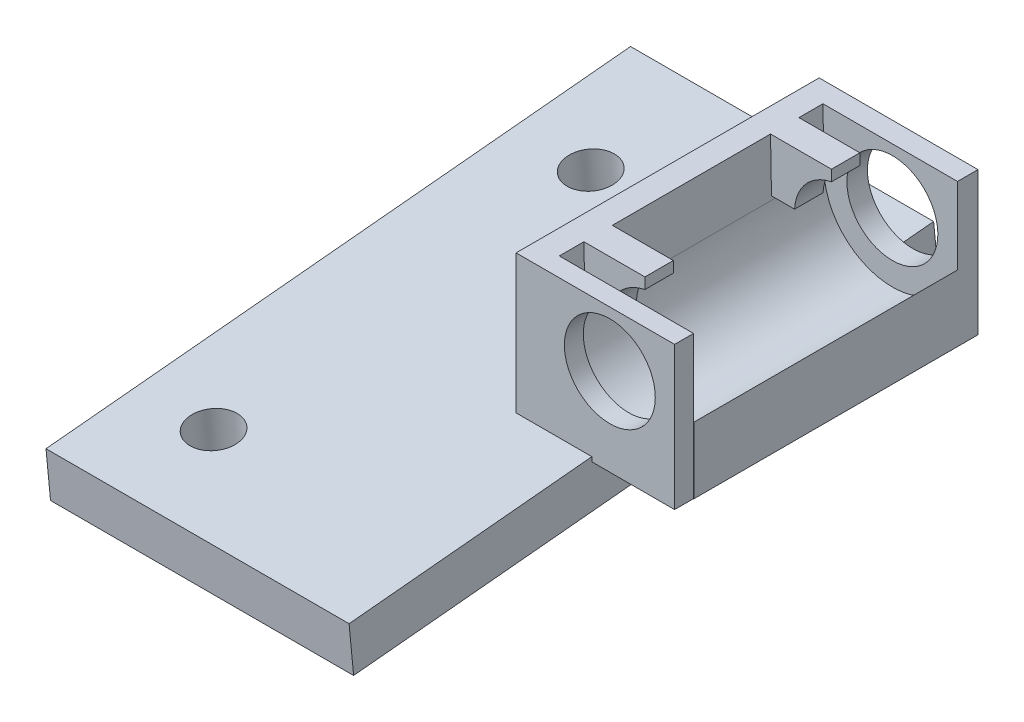
ISO-10303-21;
HEADER;
FILE_DESCRIPTION(('STEP AP214'),'2;1');
FILE_NAME('part.step','',(''),(''),'','','');
FILE_SCHEMA(('AUTOMOTIVE_DESIGN { 1 0 10303 214 1 1 1 1 }'));
ENDSEC;
DATA;
#1=APPLICATION_CONTEXT('core data for automotive mechanical design processes');
#2=APPLICATION_PROTOCOL_DEFINITION('international standard','automotive_design',2000,#1);
#3=PRODUCT_CONTEXT('',#1,'mechanical');
#4=PRODUCT('Part','Part','',(#3));
#5=PRODUCT_RELATED_PRODUCT_CATEGORY('part','',(#4));
#6=PRODUCT_DEFINITION_FORMATION('','',#4);
#7=PRODUCT_DEFINITION_CONTEXT('part definition',#1,'design');
#8=PRODUCT_DEFINITION('design','',#6,#7);
#9=PRODUCT_DEFINITION_SHAPE('','',#8);
#10=(LENGTH_UNIT() NAMED_UNIT(*) SI_UNIT(.MILLI.,.METRE.));
#11=(NAMED_UNIT(*) PLANE_ANGLE_UNIT() SI_UNIT($,.RADIAN.));
#12=(NAMED_UNIT(*) SI_UNIT($,.STERADIAN.) SOLID_ANGLE_UNIT());
#13=UNCERTAINTY_MEASURE_WITH_UNIT(LENGTH_MEASURE(1.E-05),#10,'distance_accuracy_value','');
#14=(GEOMETRIC_REPRESENTATION_CONTEXT(3) GLOBAL_UNCERTAINTY_ASSIGNED_CONTEXT((#13)) GLOBAL_UNIT_ASSIGNED_CONTEXT((#10,
#11,#12)) REPRESENTATION_CONTEXT('',''));
#15=CARTESIAN_POINT('',(0.,0.,0.));
#16=DIRECTION('',(0.,0.,1.));
#17=DIRECTION('',(1.,0.,0.));
#18=AXIS2_PLACEMENT_3D('',#15,#16,#17);
#19=CARTESIAN_POINT('',(0.,-0.379856494550895,-38.1000000000001));
#20=DIRECTION('',(0.,-1.,0.));
#21=DIRECTION('',(0.,0.,-1.));
#22=AXIS2_PLACEMENT_3D('',#19,#20,#21);
#23=PLANE('',#22);
#24=DIRECTION('',(1.,0.,0.));
#25=VECTOR('',#24,1.);
#26=CARTESIAN_POINT('',(-215.570198928087,-0.379856494550895,2.54));
#27=LINE('',#26,#25);
#28=CARTESIAN_POINT('',(-205.410198928087,-0.379856494550895,2.54));
#29=VERTEX_POINT('',#28);
#30=CARTESIAN_POINT('',(-194.315789963556,-0.379856494550895,2.54));
#31=VERTEX_POINT('',#30);
#32=EDGE_CURVE('E411',#29,#31,#27,.T.);
#33=ORIENTED_EDGE('',*,*,#32,.F.);
#34=DIRECTION('',(0.,0.,-1.));
#35=VECTOR('',#34,1.);
#36=CARTESIAN_POINT('',(-205.410198928087,-0.379856494550895,-38.1));
#37=LINE('',#36,#35);
#38=CARTESIAN_POINT('',(-205.410198928087,-0.379856494550895,-38.1000000000001));
#39=VERTEX_POINT('',#38);
#40=EDGE_CURVE('E291',#29,#39,#37,.T.);
#41=ORIENTED_EDGE('',*,*,#40,.T.);
#42=DIRECTION('',(1.,0.,0.));
#43=VECTOR('',#42,1.);
#44=CARTESIAN_POINT('',(0.,-0.379856494550895,-38.1000000000001));
#45=LINE('',#44,#43);
#46=CARTESIAN_POINT('',(-194.271100300856,-0.379856494550895,-38.1000000000001));
#47=VERTEX_POINT('',#46);
#48=EDGE_CURVE('E446',#39,#47,#45,.T.);
#49=ORIENTED_EDGE('',*,*,#48,.T.);
#50=DIRECTION('',(0.,0.,1.));
#51=VECTOR('',#50,1.);
#52=CARTESIAN_POINT('',(-194.271100300856,-0.379856494550895,-38.1000000000001));
#53=LINE('',#52,#51);
#54=CARTESIAN_POINT('',(-194.271100300856,-0.379856494550895,0.));
#55=VERTEX_POINT('',#54);
#56=EDGE_CURVE('E471',#47,#55,#53,.T.);
#57=ORIENTED_EDGE('',*,*,#56,.T.);
#58=DIRECTION('',(1.,0.,0.));
#59=VECTOR('',#58,1.);
#60=CARTESIAN_POINT('',(0.,-0.379856494550895,0.));
#61=LINE('',#60,#59);
#62=CARTESIAN_POINT('',(-194.315789963556,-0.379856494550895,0.));
#63=VERTEX_POINT('',#62);
#64=EDGE_CURVE('E460',#63,#55,#61,.T.);
#65=ORIENTED_EDGE('',*,*,#64,.F.);
#66=DIRECTION('',(0.,0.,-1.));
#67=VECTOR('',#66,1.);
#68=CARTESIAN_POINT('',(-194.315789963556,-0.379856494550895,2.54));
#69=LINE('',#68,#67);
#70=EDGE_CURVE('E433',#31,#63,#69,.T.);
#71=ORIENTED_EDGE('',*,*,#70,.F.);
#72=EDGE_LOOP('',(#33,#41,#49,#57,#65,#71));
#73=FACE_BOUND('',#72,.T.);
#74=ADVANCED_FACE('F47',(#73),#23,.T.);
#75=CARTESIAN_POINT('',(-203.,11.3497927017428,-38.1000000000001));
#76=DIRECTION('',(0.,0.,1.));
#77=DIRECTION('',(1.,0.,0.));
#78=AXIS2_PLACEMENT_3D('',#75,#76,#77);
#79=CYLINDRICAL_SURFACE('',#78,9.17500000000006);
#80=CARTESIAN_POINT('',(-203.,11.3497927017428,-35.3500000000005));
#81=DIRECTION('',(0.,0.,1.));
#82=DIRECTION('',(0.,-1.,0.));
#83=AXIS2_PLACEMENT_3D('',#80,#81,#82);
#84=CIRCLE('',#83,9.17500000000006);
#85=CARTESIAN_POINT('',(-194.271100300856,8.52367610077182,-35.3500000000005));
#86=VERTEX_POINT('',#85);
#87=CARTESIAN_POINT('',(-212.173440462279,11.1806327625625,-35.3500000000005));
#88=VERTEX_POINT('',#87);
#89=EDGE_CURVE('E386',#86,#88,#84,.F.);
#90=ORIENTED_EDGE('',*,*,#89,.T.);
#91=DIRECTION('',(0.,0.,1.));
#92=VECTOR('',#91,1.);
#93=CARTESIAN_POINT('',(-212.173440462279,11.1806327625625,-38.1000000000001));
#94=LINE('',#93,#92);
#95=CARTESIAN_POINT('',(-212.173440462279,11.1806327625625,0.));
#96=VERTEX_POINT('',#95);
#97=EDGE_CURVE('E452',#88,#96,#94,.T.);
#98=ORIENTED_EDGE('',*,*,#97,.T.);
#99=CARTESIAN_POINT('',(-203.,11.3497927017428,0.));
#100=DIRECTION('',(0.,0.,1.));
#101=DIRECTION('',(1.,0.,0.));
#102=AXIS2_PLACEMENT_3D('',#99,#100,#101);
#103=CIRCLE('',#102,9.17500000000006);
#104=CARTESIAN_POINT('',(-194.315789963556,8.38919799072162,0.));
#105=VERTEX_POINT('',#104);
#106=EDGE_CURVE('E453',#96,#105,#103,.T.);
#107=ORIENTED_EDGE('',*,*,#106,.T.);
#108=CARTESIAN_POINT('',(-194.271100300856,8.52367610077182,0.));
#109=VERTEX_POINT('',#108);
#110=EDGE_CURVE('E437',#105,#109,#103,.T.);
#111=ORIENTED_EDGE('',*,*,#110,.T.);
#112=DIRECTION('',(0.,0.,1.));
#113=VECTOR('',#112,1.);
#114=CARTESIAN_POINT('',(-194.271100300856,8.52367610077182,-38.1000000000001));
#115=LINE('',#114,#113);
#116=EDGE_CURVE('E467',#86,#109,#115,.T.);
#117=ORIENTED_EDGE('',*,*,#116,.F.);
#118=EDGE_LOOP('',(#90,#98,#107,#111,#117));
#119=FACE_BOUND('',#118,.T.);
#120=ADVANCED_FACE('F49',(#119),#79,.F.);
#121=CARTESIAN_POINT('',(-194.271100300856,0.,-38.1000000000001));
#122=DIRECTION('',(1.,0.,0.));
#123=DIRECTION('',(0.,0.,-1.));
#124=AXIS2_PLACEMENT_3D('',#121,#122,#123);
#125=PLANE('',#124);
#126=DIRECTION('',(0.,1.,0.));
#127=VECTOR('',#126,1.);
#128=CARTESIAN_POINT('',(-194.271100300856,0.,0.));
#129=LINE('',#128,#127);
#130=EDGE_CURVE('E443',#55,#109,#129,.T.);
#131=ORIENTED_EDGE('',*,*,#130,.F.);
#132=ORIENTED_EDGE('',*,*,#56,.F.);
#133=DIRECTION('',(0.,1.,0.));
#134=VECTOR('',#133,1.);
#135=CARTESIAN_POINT('',(-194.271100300856,0.,-38.1000000000001));
#136=LINE('',#135,#134);
#137=CARTESIAN_POINT('',(-194.271100300856,18.8069348308094,-38.1000000000001));
#138=VERTEX_POINT('',#137);
#139=EDGE_CURVE('E449',#47,#138,#136,.T.);
#140=ORIENTED_EDGE('',*,*,#139,.T.);
#141=DIRECTION('',(0.,0.,-1.));
#142=VECTOR('',#141,1.);
#143=CARTESIAN_POINT('',(-194.271100300856,18.8069348308094,-6.68321497454979));
#144=LINE('',#143,#142);
#145=CARTESIAN_POINT('',(-194.271100300856,18.8069348308094,-35.3500000000005));
#146=VERTEX_POINT('',#145);
#147=EDGE_CURVE('E382',#146,#138,#144,.T.);
#148=ORIENTED_EDGE('',*,*,#147,.F.);
#149=DIRECTION('',(0.,-1.,0.));
#150=VECTOR('',#149,1.);
#151=CARTESIAN_POINT('',(-194.271100300856,-0.379856494550899,-35.3500000000005));
#152=LINE('',#151,#150);
#153=EDGE_CURVE('E366',#146,#86,#152,.T.);
#154=ORIENTED_EDGE('',*,*,#153,.T.);
#155=ORIENTED_EDGE('',*,*,#116,.T.);
#156=EDGE_LOOP('',(#131,#132,#140,#148,#154,#155));
#157=FACE_BOUND('',#156,.T.);
#158=ADVANCED_FACE('F555',(#157),#125,.T.);
#159=CARTESIAN_POINT('',(-215.570198928087,0.,-38.1000000000001));
#160=DIRECTION('',(-1.,0.,0.));
#161=DIRECTION('',(0.,0.,1.));
#162=AXIS2_PLACEMENT_3D('',#159,#160,#161);
#163=PLANE('',#162);
#164=DIRECTION('',(0.,0.0954577562183424,-0.995433481844849));
#165=VECTOR('',#164,1.);
#166=CARTESIAN_POINT('',(-215.570198928087,4.08284979506725,-37.7084724017005));
#167=LINE('',#166,#165);
#168=CARTESIAN_POINT('',(-215.570198928087,0.223195748106981,2.54));
#169=VERTEX_POINT('',#168);
#170=CARTESIAN_POINT('',(-215.570198928087,4.12039559467402,-38.1000000000001));
#171=VERTEX_POINT('',#170);
#172=EDGE_CURVE('E299',#169,#171,#167,.T.);
#173=ORIENTED_EDGE('',*,*,#172,.F.);
#174=DIRECTION('',(0.,-1.,0.));
#175=VECTOR('',#174,1.);
#176=CARTESIAN_POINT('',(-215.570198928087,-0.379856494550895,2.54));
#177=LINE('',#176,#175);
#178=CARTESIAN_POINT('',(-215.570198928087,18.8069348308094,2.54));
#179=VERTEX_POINT('',#178);
#180=EDGE_CURVE('E407',#179,#169,#177,.T.);
#181=ORIENTED_EDGE('',*,*,#180,.F.);
#182=DIRECTION('',(0.,0.,1.));
#183=VECTOR('',#182,1.);
#184=CARTESIAN_POINT('',(-215.570198928087,18.8069348308094,-38.1000000000001));
#185=LINE('',#184,#183);
#186=CARTESIAN_POINT('',(-215.570198928087,18.8069348308094,-38.1000000000001));
#187=VERTEX_POINT('',#186);
#188=EDGE_CURVE('E474',#187,#179,#185,.T.);
#189=ORIENTED_EDGE('',*,*,#188,.F.);
#190=DIRECTION('',(0.,-1.,0.));
#191=VECTOR('',#190,1.);
#192=CARTESIAN_POINT('',(-215.570198928087,0.,-38.1000000000001));
#193=LINE('',#192,#191);
#194=EDGE_CURVE('E442',#187,#171,#193,.T.);
#195=ORIENTED_EDGE('',*,*,#194,.T.);
#196=EDGE_LOOP('',(#173,#181,#189,#195));
#197=FACE_BOUND('',#196,.T.);
#198=ADVANCED_FACE('F561',(#197),#163,.T.);
#199=CARTESIAN_POINT('',(0.,18.8069348308094,-38.1000000000001));
#200=DIRECTION('',(0.,1.,0.));
#201=DIRECTION('',(0.,0.,1.));
#202=AXIS2_PLACEMENT_3D('',#199,#200,#201);
#203=PLANE('',#202);
#204=DIRECTION('',(0.,0.,1.));
#205=VECTOR('',#204,1.);
#206=CARTESIAN_POINT('',(-212.314070883252,18.8069348308094,-38.1000000000001));
#207=LINE('',#206,#205);
#208=CARTESIAN_POINT('',(-212.314070883252,18.8069348308094,-28.3210000000001));
#209=VERTEX_POINT('',#208);
#210=CARTESIAN_POINT('',(-212.314070883252,18.8069348308094,-7.112));
#211=VERTEX_POINT('',#210);
#212=EDGE_CURVE('E480',#209,#211,#207,.T.);
#213=ORIENTED_EDGE('',*,*,#212,.F.);
#214=DIRECTION('',(-1.,0.,0.));
#215=VECTOR('',#214,1.);
#216=CARTESIAN_POINT('',(-204.140198928087,18.8069348308094,-28.3210000000001));
#217=LINE('',#216,#215);
#218=CARTESIAN_POINT('',(-204.140198928087,18.8069348308094,-28.3210000000001));
#219=VERTEX_POINT('',#218);
#220=EDGE_CURVE('E331',#219,#209,#217,.T.);
#221=ORIENTED_EDGE('',*,*,#220,.F.);
#222=DIRECTION('',(0.,0.,-1.));
#223=VECTOR('',#222,1.);
#224=CARTESIAN_POINT('',(-204.140198928087,18.8069348308094,-28.3210000000001));
#225=LINE('',#224,#223);
#226=CARTESIAN_POINT('',(-204.140198928087,18.8069348308094,-32.131));
#227=VERTEX_POINT('',#226);
#228=EDGE_CURVE('E344',#219,#227,#225,.T.);
#229=ORIENTED_EDGE('',*,*,#228,.T.);
#230=DIRECTION('',(-1.,0.,0.));
#231=VECTOR('',#230,1.);
#232=CARTESIAN_POINT('',(-204.140198928087,18.8069348308094,-32.131));
#233=LINE('',#232,#231);
#234=CARTESIAN_POINT('',(-212.314070883252,18.8069348308094,-32.131));
#235=VERTEX_POINT('',#234);
#236=EDGE_CURVE('E335',#227,#235,#233,.T.);
#237=ORIENTED_EDGE('',*,*,#236,.T.);
#238=CARTESIAN_POINT('',(-212.314070883252,18.8069348308094,-35.3500000000005));
#239=VERTEX_POINT('',#238);
#240=EDGE_CURVE('E477',#239,#235,#207,.T.);
#241=ORIENTED_EDGE('',*,*,#240,.F.);
#242=DIRECTION('',(1.,0.,0.));
#243=VECTOR('',#242,1.);
#244=CARTESIAN_POINT('',(-194.271100300856,18.8069348308094,-35.3500000000005));
#245=LINE('',#244,#243);
#246=EDGE_CURVE('E390',#239,#146,#245,.T.);
#247=ORIENTED_EDGE('',*,*,#246,.T.);
#248=ORIENTED_EDGE('',*,*,#147,.T.);
#249=DIRECTION('',(-1.,0.,0.));
#250=VECTOR('',#249,1.);
#251=CARTESIAN_POINT('',(0.,18.8069348308094,-38.1000000000001));
#252=LINE('',#251,#250);
#253=EDGE_CURVE('E438',#138,#187,#252,.T.);
#254=ORIENTED_EDGE('',*,*,#253,.T.);
#255=ORIENTED_EDGE('',*,*,#188,.T.);
#256=DIRECTION('',(-1.,0.,0.));
#257=VECTOR('',#256,1.);
#258=CARTESIAN_POINT('',(-215.570198928087,18.8069348308094,2.54));
#259=LINE('',#258,#257);
#260=CARTESIAN_POINT('',(-194.315789963556,18.8069348308094,2.54));
#261=VERTEX_POINT('',#260);
#262=EDGE_CURVE('E418',#261,#179,#259,.T.);
#263=ORIENTED_EDGE('',*,*,#262,.F.);
#264=DIRECTION('',(0.,0.,-1.));
#265=VECTOR('',#264,1.);
#266=CARTESIAN_POINT('',(-194.315789963556,18.8069348308094,2.54));
#267=LINE('',#266,#265);
#268=CARTESIAN_POINT('',(-194.315789963556,18.8069348308094,0.));
#269=VERTEX_POINT('',#268);
#270=EDGE_CURVE('E422',#261,#269,#267,.T.);
#271=ORIENTED_EDGE('',*,*,#270,.T.);
#272=DIRECTION('',(-1.,0.,0.));
#273=VECTOR('',#272,1.);
#274=CARTESIAN_POINT('',(-215.570198928087,18.8069348308094,0.));
#275=LINE('',#274,#273);
#276=CARTESIAN_POINT('',(-212.314070883252,18.8069348308094,0.));
#277=VERTEX_POINT('',#276);
#278=EDGE_CURVE('E412',#269,#277,#275,.T.);
#279=ORIENTED_EDGE('',*,*,#278,.T.);
#280=CARTESIAN_POINT('',(-212.314070883252,18.8069348308094,-3.302));
#281=VERTEX_POINT('',#280);
#282=EDGE_CURVE('E481',#281,#277,#207,.T.);
#283=ORIENTED_EDGE('',*,*,#282,.F.);
#284=DIRECTION('',(-1.,0.,0.));
#285=VECTOR('',#284,1.);
#286=CARTESIAN_POINT('',(-204.140198928087,18.8069348308094,-3.302));
#287=LINE('',#286,#285);
#288=CARTESIAN_POINT('',(-204.140198928087,18.8069348308094,-3.302));
#289=VERTEX_POINT('',#288);
#290=EDGE_CURVE('E362',#289,#281,#287,.T.);
#291=ORIENTED_EDGE('',*,*,#290,.F.);
#292=DIRECTION('',(0.,0.,-1.));
#293=VECTOR('',#292,1.);
#294=CARTESIAN_POINT('',(-204.140198928087,18.8069348308094,-7.112));
#295=LINE('',#294,#293);
#296=CARTESIAN_POINT('',(-204.140198928087,18.8069348308094,-7.112));
#297=VERTEX_POINT('',#296);
#298=EDGE_CURVE('E354',#289,#297,#295,.T.);
#299=ORIENTED_EDGE('',*,*,#298,.T.);
#300=DIRECTION('',(-1.,0.,0.));
#301=VECTOR('',#300,1.);
#302=CARTESIAN_POINT('',(-204.140198928087,18.8069348308094,-7.112));
#303=LINE('',#302,#301);
#304=EDGE_CURVE('E370',#297,#211,#303,.T.);
#305=ORIENTED_EDGE('',*,*,#304,.T.);
#306=EDGE_LOOP('',(#213,#221,#229,#237,#241,#247,#248,#254,#255,#263,#271,#279,#283,#291,#299,#305));
#307=FACE_BOUND('',#306,.T.);
#308=ADVANCED_FACE('F518',(#307),#203,.T.);
#309=CARTESIAN_POINT('',(-211.895214587435,-3.90738695672297,-38.1000000000001));
#310=DIRECTION('',(0.999830023136685,0.0184370505910235,0.));
#311=DIRECTION('',(-0.0184370505910235,0.999830023136685,0.));
#312=AXIS2_PLACEMENT_3D('',#309,#310,#311);
#313=PLANE('',#312);
#314=DIRECTION('',(-0.0184370505910235,0.999830023136685,0.));
#315=VECTOR('',#314,1.);
#316=CARTESIAN_POINT('',(-211.895214587435,-3.90738695672298,-32.1310000000001));
#317=LINE('',#316,#315);
#318=CARTESIAN_POINT('',(-212.182924287561,11.6949348308094,-32.1310000000001));
#319=VERTEX_POINT('',#318);
#320=EDGE_CURVE('E56',#319,#235,#317,.T.);
#321=ORIENTED_EDGE('',*,*,#320,.F.);
#322=DIRECTION('',(0.,0.,-1.));
#323=VECTOR('',#322,1.);
#324=CARTESIAN_POINT('',(-212.182924287561,11.6949348308094,-38.1000000000001));
#325=LINE('',#324,#323);
#326=CARTESIAN_POINT('',(-212.182924287561,11.6949348308094,-28.3210000000001));
#327=VERTEX_POINT('',#326);
#328=EDGE_CURVE('E503',#327,#319,#325,.T.);
#329=ORIENTED_EDGE('',*,*,#328,.F.);
#330=DIRECTION('',(0.0184370505910235,-0.999830023136685,0.));
#331=VECTOR('',#330,1.);
#332=CARTESIAN_POINT('',(-211.895214587435,-3.90738695672297,-28.3210000000001));
#333=LINE('',#332,#331);
#334=EDGE_CURVE('E499',#209,#327,#333,.T.);
#335=ORIENTED_EDGE('',*,*,#334,.F.);
#336=ORIENTED_EDGE('',*,*,#212,.T.);
#337=DIRECTION('',(-0.0184370505910235,0.999830023136685,0.));
#338=VECTOR('',#337,1.);
#339=CARTESIAN_POINT('',(-211.895214587435,-3.90738695672297,-7.112));
#340=LINE('',#339,#338);
#341=CARTESIAN_POINT('',(-212.182924287561,11.6949348308094,-7.112));
#342=VERTEX_POINT('',#341);
#343=EDGE_CURVE('E487',#342,#211,#340,.T.);
#344=ORIENTED_EDGE('',*,*,#343,.F.);
#345=DIRECTION('',(0.,0.,-1.));
#346=VECTOR('',#345,1.);
#347=CARTESIAN_POINT('',(-212.182924287561,11.6949348308094,-38.1000000000001));
#348=LINE('',#347,#346);
#349=CARTESIAN_POINT('',(-212.182924287561,11.6949348308094,-3.302));
#350=VERTEX_POINT('',#349);
#351=EDGE_CURVE('E491',#350,#342,#348,.T.);
#352=ORIENTED_EDGE('',*,*,#351,.F.);
#353=DIRECTION('',(0.0184370505910235,-0.999830023136685,0.));
#354=VECTOR('',#353,1.);
#355=CARTESIAN_POINT('',(-211.895214587435,-3.90738695672297,-3.302));
#356=LINE('',#355,#354);
#357=EDGE_CURVE('E495',#281,#350,#356,.T.);
#358=ORIENTED_EDGE('',*,*,#357,.F.);
#359=ORIENTED_EDGE('',*,*,#282,.T.);
#360=DIRECTION('',(-0.0184370505910235,0.999830023136685,0.));
#361=VECTOR('',#360,1.);
#362=CARTESIAN_POINT('',(-211.895214587435,-3.90738695672297,0.));
#363=LINE('',#362,#361);
#364=EDGE_CURVE('E456',#96,#277,#363,.T.);
#365=ORIENTED_EDGE('',*,*,#364,.F.);
#366=ORIENTED_EDGE('',*,*,#97,.F.);
#367=DIRECTION('',(0.0184370505910235,-0.999830023136685,0.));
#368=VECTOR('',#367,1.);
#369=CARTESIAN_POINT('',(-211.895214587435,-3.90738695672297,-35.3500000000005));
#370=LINE('',#369,#368);
#371=EDGE_CURVE('E470',#239,#88,#370,.T.);
#372=ORIENTED_EDGE('',*,*,#371,.F.);
#373=ORIENTED_EDGE('',*,*,#240,.T.);
#374=EDGE_LOOP('',(#321,#329,#335,#336,#344,#352,#358,#359,#365,#366,#372,#373));
#375=FACE_BOUND('',#374,.T.);
#376=ADVANCED_FACE('F531',(#375),#313,.T.);
#377=CARTESIAN_POINT('',(0.,0.,-38.1000000000001));
#378=DIRECTION('',(0.,0.,1.));
#379=DIRECTION('',(1.,0.,0.));
#380=AXIS2_PLACEMENT_3D('',#377,#378,#379);
#381=PLANE('',#380);
#382=DIRECTION('',(0.,-1.,0.));
#383=VECTOR('',#382,1.);
#384=CARTESIAN_POINT('',(-205.410198928087,1.48699544305696E-13,-38.1000000000001));
#385=LINE('',#384,#383);
#386=CARTESIAN_POINT('',(-205.410198928087,4.12039559467402,-38.1000000000001));
#387=VERTEX_POINT('',#386);
#388=EDGE_CURVE('E63',#387,#39,#385,.T.);
#389=ORIENTED_EDGE('',*,*,#388,.F.);
#390=DIRECTION('',(-1.,0.,0.));
#391=VECTOR('',#390,1.);
#392=CARTESIAN_POINT('',(0.,4.12039559467387,-38.1000000000001));
#393=LINE('',#392,#391);
#394=EDGE_CURVE('E67',#387,#171,#393,.T.);
#395=ORIENTED_EDGE('',*,*,#394,.T.);
#396=ORIENTED_EDGE('',*,*,#194,.F.);
#397=ORIENTED_EDGE('',*,*,#253,.F.);
#398=ORIENTED_EDGE('',*,*,#139,.F.);
#399=ORIENTED_EDGE('',*,*,#48,.F.);
#400=EDGE_LOOP('',(#389,#395,#396,#397,#398,#399));
#401=FACE_BOUND('',#400,.T.);
#402=CARTESIAN_POINT('',(-203.,11.3497927017428,-38.1000000000001));
#403=DIRECTION('',(0.,0.,-1.));
#404=DIRECTION('',(-1.,0.,0.));
#405=AXIS2_PLACEMENT_3D('',#402,#403,#404);
#406=CIRCLE('',#405,6.09599999999999);
#407=CARTESIAN_POINT('',(-209.096,11.3497927017428,-38.1000000000001));
#408=VERTEX_POINT('',#407);
#409=EDGE_CURVE('E377',#408,#408,#406,.T.);
#410=ORIENTED_EDGE('',*,*,#409,.F.);
#411=EDGE_LOOP('',(#410));
#412=FACE_BOUND('',#411,.T.);
#413=ADVANCED_FACE('F566',(#401,#412),#381,.F.);
#414=CARTESIAN_POINT('',(0.,0.,0.));
#415=DIRECTION('',(0.,0.,1.));
#416=DIRECTION('',(1.,0.,0.));
#417=AXIS2_PLACEMENT_3D('',#414,#415,#416);
#418=PLANE('',#417);
#419=DIRECTION('',(0.,1.,0.));
#420=VECTOR('',#419,1.);
#421=CARTESIAN_POINT('',(-194.315789963556,-0.379856494550895,0.));
#422=LINE('',#421,#420);
#423=EDGE_CURVE('E423',#63,#105,#422,.T.);
#424=ORIENTED_EDGE('',*,*,#423,.F.);
#425=ORIENTED_EDGE('',*,*,#64,.T.);
#426=ORIENTED_EDGE('',*,*,#130,.T.);
#427=ORIENTED_EDGE('',*,*,#110,.F.);
#428=EDGE_LOOP('',(#424,#425,#426,#427));
#429=FACE_BOUND('',#428,.T.);
#430=ADVANCED_FACE('F571',(#429),#418,.T.);
#431=CARTESIAN_POINT('',(0.,0.,0.));
#432=DIRECTION('',(0.,0.,-1.));
#433=DIRECTION('',(-1.,0.,0.));
#434=AXIS2_PLACEMENT_3D('',#431,#432,#433);
#435=PLANE('',#434);
#436=CARTESIAN_POINT('',(-203.,11.3497927017428,0.));
#437=DIRECTION('',(0.,0.,1.));
#438=DIRECTION('',(1.,0.,0.));
#439=AXIS2_PLACEMENT_3D('',#436,#437,#438);
#440=CIRCLE('',#439,6.09599999999999);
#441=CARTESIAN_POINT('',(-196.904,11.3497927017428,0.));
#442=VERTEX_POINT('',#441);
#443=EDGE_CURVE('E398',#442,#442,#440,.T.);
#444=ORIENTED_EDGE('',*,*,#443,.T.);
#445=EDGE_LOOP('',(#444));
#446=FACE_BOUND('',#445,.T.);
#447=ORIENTED_EDGE('',*,*,#106,.F.);
#448=ORIENTED_EDGE('',*,*,#364,.T.);
#449=ORIENTED_EDGE('',*,*,#278,.F.);
#450=EDGE_CURVE('E403',#105,#269,#422,.T.);
#451=ORIENTED_EDGE('',*,*,#450,.F.);
#452=EDGE_LOOP('',(#447,#448,#449,#451));
#453=FACE_BOUND('',#452,.T.);
#454=ADVANCED_FACE('F577',(#446,#453),#435,.T.);
#455=CARTESIAN_POINT('',(0.,0.,2.54));
#456=DIRECTION('',(0.,0.,-1.));
#457=DIRECTION('',(-1.,0.,0.));
#458=AXIS2_PLACEMENT_3D('',#455,#456,#457);
#459=PLANE('',#458);
#460=ORIENTED_EDGE('',*,*,#180,.T.);
#461=DIRECTION('',(1.,0.,0.));
#462=VECTOR('',#461,1.);
#463=CARTESIAN_POINT('',(0.,0.223195748106828,2.54));
#464=LINE('',#463,#462);
#465=CARTESIAN_POINT('',(-205.410198928087,0.223195748106979,2.54));
#466=VERTEX_POINT('',#465);
#467=EDGE_CURVE('E296',#169,#466,#464,.T.);
#468=ORIENTED_EDGE('',*,*,#467,.T.);
#469=DIRECTION('',(0.,1.,0.));
#470=VECTOR('',#469,1.);
#471=CARTESIAN_POINT('',(-205.410198928087,1.48699544305696E-13,2.54));
#472=LINE('',#471,#470);
#473=EDGE_CURVE('E229',#29,#466,#472,.T.);
#474=ORIENTED_EDGE('',*,*,#473,.F.);
#475=ORIENTED_EDGE('',*,*,#32,.T.);
#476=DIRECTION('',(0.,1.,0.));
#477=VECTOR('',#476,1.);
#478=CARTESIAN_POINT('',(-194.315789963556,-0.379856494550895,2.54));
#479=LINE('',#478,#477);
#480=EDGE_CURVE('E415',#31,#261,#479,.T.);
#481=ORIENTED_EDGE('',*,*,#480,.T.);
#482=ORIENTED_EDGE('',*,*,#262,.T.);
#483=EDGE_LOOP('',(#460,#468,#474,#475,#481,#482));
#484=FACE_BOUND('',#483,.T.);
#485=CARTESIAN_POINT('',(-203.,11.3497927017428,2.54));
#486=DIRECTION('',(0.,0.,1.));
#487=DIRECTION('',(1.,0.,0.));
#488=AXIS2_PLACEMENT_3D('',#485,#486,#487);
#489=CIRCLE('',#488,6.09599999999999);
#490=CARTESIAN_POINT('',(-196.904,11.3497927017428,2.54));
#491=VERTEX_POINT('',#490);
#492=EDGE_CURVE('E399',#491,#491,#489,.T.);
#493=ORIENTED_EDGE('',*,*,#492,.F.);
#494=EDGE_LOOP('',(#493));
#495=FACE_BOUND('',#494,.T.);
#496=ADVANCED_FACE('F585',(#484,#495),#459,.F.);
#497=CARTESIAN_POINT('',(-194.315789963556,-0.379856494550895,2.54));
#498=DIRECTION('',(-1.,0.,0.));
#499=DIRECTION('',(0.,0.,1.));
#500=AXIS2_PLACEMENT_3D('',#497,#498,#499);
#501=PLANE('',#500);
#502=ORIENTED_EDGE('',*,*,#423,.T.);
#503=ORIENTED_EDGE('',*,*,#450,.T.);
#504=ORIENTED_EDGE('',*,*,#270,.F.);
#505=ORIENTED_EDGE('',*,*,#480,.F.);
#506=ORIENTED_EDGE('',*,*,#70,.T.);
#507=EDGE_LOOP('',(#502,#503,#504,#505,#506));
#508=FACE_BOUND('',#507,.T.);
#509=ADVANCED_FACE('F581',(#508),#501,.F.);
#510=CARTESIAN_POINT('',(-203.,11.3497927017428,2.54));
#511=DIRECTION('',(0.,0.,-1.));
#512=DIRECTION('',(-1.,0.,0.));
#513=AXIS2_PLACEMENT_3D('',#510,#511,#512);
#514=CYLINDRICAL_SURFACE('',#513,6.09599999999999);
#515=ORIENTED_EDGE('',*,*,#492,.T.);
#516=EDGE_LOOP('',(#515));
#517=FACE_BOUND('',#516,.T.);
#518=ORIENTED_EDGE('',*,*,#443,.F.);
#519=EDGE_LOOP('',(#518));
#520=FACE_BOUND('',#519,.T.);
#521=ADVANCED_FACE('F584',(#517,#520),#514,.F.);
#522=CARTESIAN_POINT('',(0.,0.,-35.3500000000005));
#523=DIRECTION('',(0.,0.,1.));
#524=DIRECTION('',(1.,0.,0.));
#525=AXIS2_PLACEMENT_3D('',#522,#523,#524);
#526=PLANE('',#525);
#527=ORIENTED_EDGE('',*,*,#89,.F.);
#528=ORIENTED_EDGE('',*,*,#153,.F.);
#529=ORIENTED_EDGE('',*,*,#246,.F.);
#530=ORIENTED_EDGE('',*,*,#371,.T.);
#531=EDGE_LOOP('',(#527,#528,#529,#530));
#532=FACE_BOUND('',#531,.T.);
#533=CARTESIAN_POINT('',(-203.,11.3497927017428,-35.3500000000005));
#534=DIRECTION('',(0.,0.,1.));
#535=DIRECTION('',(0.,-1.,0.));
#536=AXIS2_PLACEMENT_3D('',#533,#534,#535);
#537=CIRCLE('',#536,6.09599999999999);
#538=CARTESIAN_POINT('',(-203.,5.25379270174281,-35.3500000000005));
#539=VERTEX_POINT('',#538);
#540=EDGE_CURVE('E381',#539,#539,#537,.F.);
#541=ORIENTED_EDGE('',*,*,#540,.T.);
#542=EDGE_LOOP('',(#541));
#543=FACE_BOUND('',#542,.T.);
#544=ADVANCED_FACE('F594',(#532,#543),#526,.T.);
#545=CARTESIAN_POINT('',(-203.,11.3497927017428,-6.68321497454979));
#546=DIRECTION('',(0.,0.,-1.));
#547=DIRECTION('',(-1.,0.,0.));
#548=AXIS2_PLACEMENT_3D('',#545,#546,#547);
#549=CYLINDRICAL_SURFACE('',#548,6.09599999999999);
#550=ORIENTED_EDGE('',*,*,#409,.T.);
#551=EDGE_LOOP('',(#550));
#552=FACE_BOUND('',#551,.T.);
#553=ORIENTED_EDGE('',*,*,#540,.F.);
#554=EDGE_LOOP('',(#553));
#555=FACE_BOUND('',#554,.T.);
#556=ADVANCED_FACE('F598',(#552,#555),#549,.F.);
#557=CARTESIAN_POINT('',(-204.140198928087,18.8069348308094,-3.302));
#558=DIRECTION('',(0.,0.,1.));
#559=DIRECTION('',(0.,-1.,0.));
#560=AXIS2_PLACEMENT_3D('',#557,#558,#559);
#561=PLANE('',#560);
#562=CARTESIAN_POINT('',(-203.,11.3497927017428,-3.302));
#563=DIRECTION('',(0.,0.,1.));
#564=DIRECTION('',(0.,-1.,0.));
#565=AXIS2_PLACEMENT_3D('',#562,#563,#564);
#566=CIRCLE('',#565,6.09599999999999);
#567=CARTESIAN_POINT('',(-204.140198928087,17.3382117255245,-3.302));
#568=VERTEX_POINT('',#567);
#569=CARTESIAN_POINT('',(-209.086221562739,11.6949348308093,-3.302));
#570=VERTEX_POINT('',#569);
#571=EDGE_CURVE('E323',#568,#570,#566,.T.);
#572=ORIENTED_EDGE('',*,*,#571,.F.);
#573=DIRECTION('',(0.,1.,0.));
#574=VECTOR('',#573,1.);
#575=CARTESIAN_POINT('',(-204.140198928087,18.8069348308094,-3.302));
#576=LINE('',#575,#574);
#577=EDGE_CURVE('E351',#568,#289,#576,.T.);
#578=ORIENTED_EDGE('',*,*,#577,.T.);
#579=ORIENTED_EDGE('',*,*,#290,.T.);
#580=ORIENTED_EDGE('',*,*,#357,.T.);
#581=DIRECTION('',(-1.,0.,0.));
#582=VECTOR('',#581,1.);
#583=CARTESIAN_POINT('',(-204.140198928087,11.6949348308094,-3.302));
#584=LINE('',#583,#582);
#585=EDGE_CURVE('E363',#570,#350,#584,.T.);
#586=ORIENTED_EDGE('',*,*,#585,.F.);
#587=EDGE_LOOP('',(#572,#578,#579,#580,#586));
#588=FACE_BOUND('',#587,.T.);
#589=ADVANCED_FACE('F602',(#588),#561,.T.);
#590=CARTESIAN_POINT('',(-204.140198928087,11.6949348308094,-3.302));
#591=DIRECTION('',(0.,-1.,0.));
#592=DIRECTION('',(0.,0.,-1.));
#593=AXIS2_PLACEMENT_3D('',#590,#591,#592);
#594=PLANE('',#593);
#595=DIRECTION('',(0.,0.,1.));
#596=VECTOR('',#595,1.);
#597=CARTESIAN_POINT('',(-209.086221562739,11.6949348308093,-45.466));
#598=LINE('',#597,#596);
#599=CARTESIAN_POINT('',(-209.086221562739,11.6949348308094,-7.112));
#600=VERTEX_POINT('',#599);
#601=EDGE_CURVE('E320',#570,#600,#598,.F.);
#602=ORIENTED_EDGE('',*,*,#601,.F.);
#603=ORIENTED_EDGE('',*,*,#585,.T.);
#604=ORIENTED_EDGE('',*,*,#351,.T.);
#605=DIRECTION('',(-1.,0.,0.));
#606=VECTOR('',#605,1.);
#607=CARTESIAN_POINT('',(-204.140198928087,11.6949348308094,-7.112));
#608=LINE('',#607,#606);
#609=EDGE_CURVE('E367',#600,#342,#608,.T.);
#610=ORIENTED_EDGE('',*,*,#609,.F.);
#611=EDGE_LOOP('',(#602,#603,#604,#610));
#612=FACE_BOUND('',#611,.T.);
#613=ADVANCED_FACE('F605',(#612),#594,.T.);
#614=CARTESIAN_POINT('',(-204.140198928087,11.6949348308094,-7.112));
#615=DIRECTION('',(0.,0.,-1.));
#616=DIRECTION('',(-1.,0.,0.));
#617=AXIS2_PLACEMENT_3D('',#614,#615,#616);
#618=PLANE('',#617);
#619=CARTESIAN_POINT('',(-203.,11.3497927017428,-7.112));
#620=DIRECTION('',(0.,0.,-1.));
#621=DIRECTION('',(-1.,0.,0.));
#622=AXIS2_PLACEMENT_3D('',#619,#620,#621);
#623=CIRCLE('',#622,6.09599999999999);
#624=CARTESIAN_POINT('',(-204.140198928087,17.3382117255245,-7.112));
#625=VERTEX_POINT('',#624);
#626=EDGE_CURVE('E317',#600,#625,#623,.T.);
#627=ORIENTED_EDGE('',*,*,#626,.F.);
#628=ORIENTED_EDGE('',*,*,#609,.T.);
#629=ORIENTED_EDGE('',*,*,#343,.T.);
#630=ORIENTED_EDGE('',*,*,#304,.F.);
#631=DIRECTION('',(0.,-1.,0.));
#632=VECTOR('',#631,1.);
#633=CARTESIAN_POINT('',(-204.140198928087,11.6949348308094,-7.112));
#634=LINE('',#633,#632);
#635=EDGE_CURVE('E358',#297,#625,#634,.T.);
#636=ORIENTED_EDGE('',*,*,#635,.T.);
#637=EDGE_LOOP('',(#627,#628,#629,#630,#636));
#638=FACE_BOUND('',#637,.T.);
#639=ADVANCED_FACE('F607',(#638),#618,.T.);
#640=CARTESIAN_POINT('',(-204.140198928087,0.,0.));
#641=DIRECTION('',(1.,0.,0.));
#642=DIRECTION('',(0.,0.,-1.));
#643=AXIS2_PLACEMENT_3D('',#640,#641,#642);
#644=PLANE('',#643);
#645=DIRECTION('',(0.,0.,1.));
#646=VECTOR('',#645,1.);
#647=CARTESIAN_POINT('',(-204.140198928087,17.3382117255245,-45.466));
#648=LINE('',#647,#646);
#649=EDGE_CURVE('E314',#625,#568,#648,.T.);
#650=ORIENTED_EDGE('',*,*,#649,.F.);
#651=ORIENTED_EDGE('',*,*,#635,.F.);
#652=ORIENTED_EDGE('',*,*,#298,.F.);
#653=ORIENTED_EDGE('',*,*,#577,.F.);
#654=EDGE_LOOP('',(#650,#651,#652,#653));
#655=FACE_BOUND('',#654,.T.);
#656=ADVANCED_FACE('F610',(#655),#644,.T.);
#657=CARTESIAN_POINT('',(-204.140198928087,11.6949348308094,-32.1310000000001));
#658=DIRECTION('',(0.,-1.,0.));
#659=DIRECTION('',(0.,0.,-1.));
#660=AXIS2_PLACEMENT_3D('',#657,#658,#659);
#661=PLANE('',#660);
#662=DIRECTION('',(0.,0.,1.));
#663=VECTOR('',#662,1.);
#664=CARTESIAN_POINT('',(-209.086221562739,11.6949348308094,-45.466));
#665=LINE('',#664,#663);
#666=CARTESIAN_POINT('',(-209.086221562739,11.6949348308094,-28.3210000000001));
#667=VERTEX_POINT('',#666);
#668=CARTESIAN_POINT('',(-209.086221562739,11.6949348308094,-32.1310000000001));
#669=VERTEX_POINT('',#668);
#670=EDGE_CURVE('E311',#667,#669,#665,.F.);
#671=ORIENTED_EDGE('',*,*,#670,.F.);
#672=DIRECTION('',(-1.,0.,0.));
#673=VECTOR('',#672,1.);
#674=CARTESIAN_POINT('',(-204.140198928087,11.6949348308094,-28.3210000000001));
#675=LINE('',#674,#673);
#676=EDGE_CURVE('E327',#667,#327,#675,.T.);
#677=ORIENTED_EDGE('',*,*,#676,.T.);
#678=ORIENTED_EDGE('',*,*,#328,.T.);
#679=DIRECTION('',(-1.,0.,0.));
#680=VECTOR('',#679,1.);
#681=CARTESIAN_POINT('',(-204.140198928087,11.6949348308094,-32.1310000000001));
#682=LINE('',#681,#680);
#683=EDGE_CURVE('E326',#669,#319,#682,.T.);
#684=ORIENTED_EDGE('',*,*,#683,.F.);
#685=EDGE_LOOP('',(#671,#677,#678,#684));
#686=FACE_BOUND('',#685,.T.);
#687=ADVANCED_FACE('F529',(#686),#661,.T.);
#688=CARTESIAN_POINT('',(-204.140198928087,18.8069348308094,-32.131));
#689=DIRECTION('',(0.,0.,-1.));
#690=DIRECTION('',(0.,1.,0.));
#691=AXIS2_PLACEMENT_3D('',#688,#689,#690);
#692=PLANE('',#691);
#693=CARTESIAN_POINT('',(-203.,11.3497927017428,-32.1310000000001));
#694=DIRECTION('',(0.,0.,-1.));
#695=DIRECTION('',(0.,1.,0.));
#696=AXIS2_PLACEMENT_3D('',#693,#694,#695);
#697=CIRCLE('',#696,6.09599999999999);
#698=CARTESIAN_POINT('',(-204.140198928087,17.3382117255245,-32.131));
#699=VERTEX_POINT('',#698);
#700=EDGE_CURVE('E308',#669,#699,#697,.T.);
#701=ORIENTED_EDGE('',*,*,#700,.F.);
#702=ORIENTED_EDGE('',*,*,#683,.T.);
#703=ORIENTED_EDGE('',*,*,#320,.T.);
#704=ORIENTED_EDGE('',*,*,#236,.F.);
#705=DIRECTION('',(0.,-1.,0.));
#706=VECTOR('',#705,1.);
#707=CARTESIAN_POINT('',(-204.140198928087,18.8069348308094,-32.131));
#708=LINE('',#707,#706);
#709=EDGE_CURVE('E330',#227,#699,#708,.T.);
#710=ORIENTED_EDGE('',*,*,#709,.T.);
#711=EDGE_LOOP('',(#701,#702,#703,#704,#710));
#712=FACE_BOUND('',#711,.T.);
#713=ADVANCED_FACE('F511',(#712),#692,.T.);
#714=CARTESIAN_POINT('',(-204.140198928087,11.6949348308094,-28.3210000000001));
#715=DIRECTION('',(0.,0.,1.));
#716=DIRECTION('',(1.,0.,0.));
#717=AXIS2_PLACEMENT_3D('',#714,#715,#716);
#718=PLANE('',#717);
#719=CARTESIAN_POINT('',(-203.,11.3497927017428,-28.3210000000001));
#720=DIRECTION('',(0.,0.,1.));
#721=DIRECTION('',(1.,0.,0.));
#722=AXIS2_PLACEMENT_3D('',#719,#720,#721);
#723=CIRCLE('',#722,6.09599999999999);
#724=CARTESIAN_POINT('',(-204.140198928087,17.3382117255245,-28.3210000000001));
#725=VERTEX_POINT('',#724);
#726=EDGE_CURVE('E305',#725,#667,#723,.T.);
#727=ORIENTED_EDGE('',*,*,#726,.F.);
#728=DIRECTION('',(0.,1.,0.));
#729=VECTOR('',#728,1.);
#730=CARTESIAN_POINT('',(-204.140198928087,11.6949348308094,-28.3210000000001));
#731=LINE('',#730,#729);
#732=EDGE_CURVE('E348',#725,#219,#731,.T.);
#733=ORIENTED_EDGE('',*,*,#732,.T.);
#734=ORIENTED_EDGE('',*,*,#220,.T.);
#735=ORIENTED_EDGE('',*,*,#334,.T.);
#736=ORIENTED_EDGE('',*,*,#676,.F.);
#737=EDGE_LOOP('',(#727,#733,#734,#735,#736));
#738=FACE_BOUND('',#737,.T.);
#739=ADVANCED_FACE('F534',(#738),#718,.T.);
#740=CARTESIAN_POINT('',(-204.140198928087,0.,0.));
#741=DIRECTION('',(-1.,0.,0.));
#742=DIRECTION('',(0.,0.,1.));
#743=AXIS2_PLACEMENT_3D('',#740,#741,#742);
#744=PLANE('',#743);
#745=ORIENTED_EDGE('',*,*,#732,.F.);
#746=DIRECTION('',(0.,0.,1.));
#747=VECTOR('',#746,1.);
#748=CARTESIAN_POINT('',(-204.140198928087,17.3382117255245,-45.466));
#749=LINE('',#748,#747);
#750=EDGE_CURVE('E11',#725,#699,#749,.F.);
#751=ORIENTED_EDGE('',*,*,#750,.T.);
#752=ORIENTED_EDGE('',*,*,#709,.F.);
#753=ORIENTED_EDGE('',*,*,#228,.F.);
#754=EDGE_LOOP('',(#745,#751,#752,#753));
#755=FACE_BOUND('',#754,.T.);
#756=ADVANCED_FACE('F525',(#755),#744,.F.);
#757=CARTESIAN_POINT('',(-203.,11.3497927017428,-45.466));
#758=DIRECTION('',(0.,0.,1.));
#759=DIRECTION('',(1.,0.,0.));
#760=AXIS2_PLACEMENT_3D('',#757,#758,#759);
#761=CYLINDRICAL_SURFACE('',#760,6.09599999999999);
#762=ORIENTED_EDGE('',*,*,#670,.T.);
#763=ORIENTED_EDGE('',*,*,#700,.T.);
#764=ORIENTED_EDGE('',*,*,#750,.F.);
#765=ORIENTED_EDGE('',*,*,#726,.T.);
#766=EDGE_LOOP('',(#762,#763,#764,#765));
#767=FACE_BOUND('',#766,.T.);
#768=ADVANCED_FACE('F535',(#767),#761,.F.);
#769=ORIENTED_EDGE('',*,*,#571,.T.);
#770=ORIENTED_EDGE('',*,*,#601,.T.);
#771=ORIENTED_EDGE('',*,*,#626,.T.);
#772=ORIENTED_EDGE('',*,*,#649,.T.);
#773=EDGE_LOOP('',(#769,#770,#771,#772));
#774=FACE_BOUND('',#773,.T.);
#775=ADVANCED_FACE('F537',(#774),#761,.F.);
#776=CARTESIAN_POINT('',(0.,0.462517438025118,0.0443534175321376));
#777=DIRECTION('',(0.,0.995433481844849,0.0954577562183424));
#778=DIRECTION('',(0.,-0.0954577562183424,0.995433481844849));
#779=AXIS2_PLACEMENT_3D('',#776,#777,#778);
#780=PLANE('',#779);
#781=CARTESIAN_POINT('',(-235.857142857137,-1.72099224172057,22.8139923579213));
#782=DIRECTION('',(0.,0.995433481844849,0.0954577562183425));
#783=DIRECTION('',(0.,-0.0954577562183425,0.995433481844849));
#784=AXIS2_PLACEMENT_3D('',#781,#782,#783);
#785=CIRCLE('',#784,3.175);
#786=CARTESIAN_POINT('',(-235.857142857137,-2.02407061771381,25.9744936627787));
#787=VERTEX_POINT('',#786);
#788=EDGE_CURVE('E260',#787,#787,#785,.T.);
#789=ORIENTED_EDGE('',*,*,#788,.F.);
#790=EDGE_LOOP('',(#789));
#791=FACE_BOUND('',#790,.T.);
#792=CARTESIAN_POINT('',(-235.857142857138,3.12826177417123,-27.754028519797));
#793=DIRECTION('',(0.,0.995433481844849,0.0954577562183425));
#794=DIRECTION('',(0.,-0.0954577562183425,0.995433481844849));
#795=AXIS2_PLACEMENT_3D('',#792,#793,#794);
#796=CIRCLE('',#795,3.17500000000003);
#797=CARTESIAN_POINT('',(-235.857142857138,2.82518339817799,-24.5935272149396));
#798=VERTEX_POINT('',#797);
#799=EDGE_CURVE('E264',#798,#798,#796,.T.);
#800=ORIENTED_EDGE('',*,*,#799,.F.);
#801=EDGE_LOOP('',(#800));
#802=FACE_BOUND('',#801,.T.);
#803=ORIENTED_EDGE('',*,*,#394,.F.);
#804=DIRECTION('',(0.,0.0954577562183424,-0.995433481844849));
#805=VECTOR('',#804,1.);
#806=CARTESIAN_POINT('',(-205.410198928087,4.61791608228619,-43.2881436448197));
#807=LINE('',#806,#805);
#808=CARTESIAN_POINT('',(-205.410198928087,4.61791608228619,-43.2881436448197));
#809=VERTEX_POINT('',#808);
#810=EDGE_CURVE('E273',#387,#809,#807,.T.);
#811=ORIENTED_EDGE('',*,*,#810,.T.);
#812=DIRECTION('',(-1.,0.,0.));
#813=VECTOR('',#812,1.);
#814=CARTESIAN_POINT('',(-246.050198928087,4.61791608228622,-43.2881436448197));
#815=LINE('',#814,#813);
#816=CARTESIAN_POINT('',(-246.050198928087,4.61791608228622,-43.2881436448197));
#817=VERTEX_POINT('',#816);
#818=EDGE_CURVE('E278',#809,#817,#815,.T.);
#819=ORIENTED_EDGE('',*,*,#818,.T.);
#820=DIRECTION('',(0.,-0.0954577562183424,0.995433481844849));
#821=VECTOR('',#820,1.);
#822=CARTESIAN_POINT('',(-246.050198928087,4.61791608228622,-43.2881436448197));
#823=LINE('',#822,#821);
#824=CARTESIAN_POINT('',(-246.050198928087,-2.89842764234606,35.0922887156437));
#825=VERTEX_POINT('',#824);
#826=EDGE_CURVE('E268',#817,#825,#823,.T.);
#827=ORIENTED_EDGE('',*,*,#826,.T.);
#828=DIRECTION('',(1.,0.,0.));
#829=VECTOR('',#828,1.);
#830=CARTESIAN_POINT('',(-246.050198928087,-2.89842764234606,35.0922887156437));
#831=LINE('',#830,#829);
#832=CARTESIAN_POINT('',(-205.410198928087,-2.89842764234609,35.0922887156437));
#833=VERTEX_POINT('',#832);
#834=EDGE_CURVE('E223',#825,#833,#831,.T.);
#835=ORIENTED_EDGE('',*,*,#834,.T.);
#836=EDGE_CURVE('E274',#833,#466,#807,.T.);
#837=ORIENTED_EDGE('',*,*,#836,.T.);
#838=ORIENTED_EDGE('',*,*,#467,.F.);
#839=ORIENTED_EDGE('',*,*,#172,.T.);
#840=EDGE_LOOP('',(#803,#811,#819,#827,#835,#837,#838,#839));
#841=FACE_BOUND('',#840,.T.);
#842=ADVANCED_FACE('F543',(#791,#802,#841),#780,.T.);
#843=CARTESIAN_POINT('',(-205.410198928087,4.61791608228619,-43.2881436448197));
#844=DIRECTION('',(-1.,0.,0.));
#845=DIRECTION('',(0.,-1.,0.));
#846=AXIS2_PLACEMENT_3D('',#843,#844,#845);
#847=PLANE('',#846);
#848=ORIENTED_EDGE('',*,*,#810,.F.);
#849=ORIENTED_EDGE('',*,*,#388,.T.);
#850=ORIENTED_EDGE('',*,*,#40,.F.);
#851=ORIENTED_EDGE('',*,*,#473,.T.);
#852=ORIENTED_EDGE('',*,*,#836,.F.);
#853=DIRECTION('',(0.,-0.995433481844849,-0.0954577562183425));
#854=VECTOR('',#853,1.);
#855=CARTESIAN_POINT('',(-205.410198928087,-2.89842764234609,35.0922887156437));
#856=LINE('',#855,#854);
#857=CARTESIAN_POINT('',(-205.410198928087,-9.21943025206088,34.4861319636573));
#858=VERTEX_POINT('',#857);
#859=EDGE_CURVE('E230',#833,#858,#856,.T.);
#860=ORIENTED_EDGE('',*,*,#859,.T.);
#861=DIRECTION('',(0.,0.0954577562183424,-0.995433481844849));
#862=VECTOR('',#861,1.);
#863=CARTESIAN_POINT('',(-205.410198928087,-1.7030865274286,-43.8943003968061));
#864=LINE('',#863,#862);
#865=CARTESIAN_POINT('',(-205.410198928087,-1.7030865274286,-43.8943003968061));
#866=VERTEX_POINT('',#865);
#867=EDGE_CURVE('E240',#858,#866,#864,.T.);
#868=ORIENTED_EDGE('',*,*,#867,.T.);
#869=DIRECTION('',(0.,-0.995433481844849,-0.0954577562183425));
#870=VECTOR('',#869,1.);
#871=CARTESIAN_POINT('',(-205.410198928087,4.61791608228619,-43.2881436448197));
#872=LINE('',#871,#870);
#873=EDGE_CURVE('E283',#809,#866,#872,.T.);
#874=ORIENTED_EDGE('',*,*,#873,.F.);
#875=EDGE_LOOP('',(#848,#849,#850,#851,#852,#860,#868,#874));
#876=FACE_BOUND('',#875,.T.);
#877=ADVANCED_FACE('F668',(#876),#847,.F.);
#878=CARTESIAN_POINT('',(-246.050198928087,4.61791608228622,-43.2881436448197));
#879=DIRECTION('',(1.,0.,0.));
#880=DIRECTION('',(0.,1.,0.));
#881=AXIS2_PLACEMENT_3D('',#878,#879,#880);
#882=PLANE('',#881);
#883=DIRECTION('',(0.,-0.995433481844849,-0.0954577562183425));
#884=VECTOR('',#883,1.);
#885=CARTESIAN_POINT('',(-246.050198928087,4.61791608228622,-43.2881436448197));
#886=LINE('',#885,#884);
#887=CARTESIAN_POINT('',(-246.050198928087,-1.70308652742857,-43.8943003968061));
#888=VERTEX_POINT('',#887);
#889=EDGE_CURVE('E245',#817,#888,#886,.T.);
#890=ORIENTED_EDGE('',*,*,#889,.T.);
#891=DIRECTION('',(0.,-0.0954577562183424,0.995433481844849));
#892=VECTOR('',#891,1.);
#893=CARTESIAN_POINT('',(-246.050198928087,-1.70308652742857,-43.8943003968061));
#894=LINE('',#893,#892);
#895=CARTESIAN_POINT('',(-246.050198928087,-9.21943025206085,34.4861319636573));
#896=VERTEX_POINT('',#895);
#897=EDGE_CURVE('E237',#888,#896,#894,.T.);
#898=ORIENTED_EDGE('',*,*,#897,.T.);
#899=DIRECTION('',(0.,-0.995433481844849,-0.0954577562183425));
#900=VECTOR('',#899,1.);
#901=CARTESIAN_POINT('',(-246.050198928087,-2.89842764234606,35.0922887156437));
#902=LINE('',#901,#900);
#903=EDGE_CURVE('E218',#825,#896,#902,.T.);
#904=ORIENTED_EDGE('',*,*,#903,.F.);
#905=ORIENTED_EDGE('',*,*,#826,.F.);
#906=EDGE_LOOP('',(#890,#898,#904,#905));
#907=FACE_BOUND('',#906,.T.);
#908=ADVANCED_FACE('F243',(#907),#882,.F.);
#909=CARTESIAN_POINT('',(-246.050198928087,-2.89842764234606,35.0922887156437));
#910=DIRECTION('',(0.,0.0954577562183425,-0.995433481844849));
#911=DIRECTION('',(0.,0.995433481844849,0.0954577562183425));
#912=AXIS2_PLACEMENT_3D('',#909,#910,#911);
#913=PLANE('',#912);
#914=ORIENTED_EDGE('',*,*,#903,.T.);
#915=DIRECTION('',(1.,0.,0.));
#916=VECTOR('',#915,1.);
#917=CARTESIAN_POINT('',(-246.050198928087,-9.21943025206085,34.4861319636573));
#918=LINE('',#917,#916);
#919=EDGE_CURVE('E222',#896,#858,#918,.T.);
#920=ORIENTED_EDGE('',*,*,#919,.T.);
#921=ORIENTED_EDGE('',*,*,#859,.F.);
#922=ORIENTED_EDGE('',*,*,#834,.F.);
#923=EDGE_LOOP('',(#914,#920,#921,#922));
#924=FACE_BOUND('',#923,.T.);
#925=ADVANCED_FACE('F220',(#924),#913,.F.);
#926=CARTESIAN_POINT('',(-246.050198928087,4.61791608228622,-43.2881436448197));
#927=DIRECTION('',(0.,-0.0954577562183425,0.995433481844849));
#928=DIRECTION('',(0.,-0.995433481844849,-0.0954577562183425));
#929=AXIS2_PLACEMENT_3D('',#926,#927,#928);
#930=PLANE('',#929);
#931=ORIENTED_EDGE('',*,*,#873,.T.);
#932=DIRECTION('',(-1.,0.,0.));
#933=VECTOR('',#932,1.);
#934=CARTESIAN_POINT('',(-246.050198928087,-1.70308652742857,-43.8943003968061));
#935=LINE('',#934,#933);
#936=EDGE_CURVE('E257',#866,#888,#935,.T.);
#937=ORIENTED_EDGE('',*,*,#936,.T.);
#938=ORIENTED_EDGE('',*,*,#889,.F.);
#939=ORIENTED_EDGE('',*,*,#818,.F.);
#940=EDGE_LOOP('',(#931,#937,#938,#939));
#941=FACE_BOUND('',#940,.T.);
#942=ADVANCED_FACE('F694',(#941),#930,.F.);
#943=CARTESIAN_POINT('',(-235.857142857138,3.12826177417123,-27.754028519797));
#944=DIRECTION('',(0.,-0.995433481844849,-0.0954577562183425));
#945=DIRECTION('',(0.,0.0954577562183425,-0.995433481844849));
#946=AXIS2_PLACEMENT_3D('',#943,#944,#945);
#947=CYLINDRICAL_SURFACE('',#946,3.17500000000003);
#948=ORIENTED_EDGE('',*,*,#799,.T.);
#949=EDGE_LOOP('',(#948));
#950=FACE_BOUND('',#949,.T.);
#951=CARTESIAN_POINT('',(-235.857142857138,-3.19274083554356,-28.3601852717835));
#952=DIRECTION('',(0.,0.995433481844849,0.0954577562183425));
#953=DIRECTION('',(0.,-0.0954577562183425,0.995433481844849));
#954=AXIS2_PLACEMENT_3D('',#951,#952,#953);
#955=CIRCLE('',#954,3.17500000000003);
#956=CARTESIAN_POINT('',(-235.857142857138,-3.4958192115368,-25.199683966926));
#957=VERTEX_POINT('',#956);
#958=EDGE_CURVE('E247',#957,#957,#955,.T.);
#959=ORIENTED_EDGE('',*,*,#958,.F.);
#960=EDGE_LOOP('',(#959));
#961=FACE_BOUND('',#960,.T.);
#962=ADVANCED_FACE('F703',(#950,#961),#947,.F.);
#963=CARTESIAN_POINT('',(-235.857142857137,-1.72099224172057,22.8139923579213));
#964=DIRECTION('',(0.,-0.995433481844849,-0.0954577562183425));
#965=DIRECTION('',(0.,0.0954577562183425,-0.995433481844849));
#966=AXIS2_PLACEMENT_3D('',#963,#964,#965);
#967=CYLINDRICAL_SURFACE('',#966,3.175);
#968=ORIENTED_EDGE('',*,*,#788,.T.);
#969=EDGE_LOOP('',(#968));
#970=FACE_BOUND('',#969,.T.);
#971=CARTESIAN_POINT('',(-235.857142857137,-8.04199485143536,22.2078356059349));
#972=DIRECTION('',(0.,0.995433481844849,0.0954577562183425));
#973=DIRECTION('',(0.,-0.0954577562183425,0.995433481844849));
#974=AXIS2_PLACEMENT_3D('',#971,#972,#973);
#975=CIRCLE('',#974,3.175);
#976=CARTESIAN_POINT('',(-235.857142857137,-8.3450732274286,25.3683369107923));
#977=VERTEX_POINT('',#976);
#978=EDGE_CURVE('E251',#977,#977,#975,.T.);
#979=ORIENTED_EDGE('',*,*,#978,.F.);
#980=EDGE_LOOP('',(#979));
#981=FACE_BOUND('',#980,.T.);
#982=ADVANCED_FACE('F713',(#970,#981),#967,.F.);
#983=CARTESIAN_POINT('',(0.,-5.85848517168967,-0.561803334454337));
#984=DIRECTION('',(0.,0.995433481844849,0.0954577562183424));
#985=DIRECTION('',(0.,-0.0954577562183424,0.995433481844849));
#986=AXIS2_PLACEMENT_3D('',#983,#984,#985);
#987=PLANE('',#986);
#988=ORIENTED_EDGE('',*,*,#978,.T.);
#989=EDGE_LOOP('',(#988));
#990=FACE_BOUND('',#989,.T.);
#991=ORIENTED_EDGE('',*,*,#958,.T.);
#992=EDGE_LOOP('',(#991));
#993=FACE_BOUND('',#992,.T.);
#994=ORIENTED_EDGE('',*,*,#897,.F.);
#995=ORIENTED_EDGE('',*,*,#936,.F.);
#996=ORIENTED_EDGE('',*,*,#867,.F.);
#997=ORIENTED_EDGE('',*,*,#919,.F.);
#998=EDGE_LOOP('',(#994,#995,#996,#997));
#999=FACE_BOUND('',#998,.T.);
#1000=ADVANCED_FACE('F235',(#990,#993,#999),#987,.F.);
#1001=CLOSED_SHELL('',(#74,#120,#158,#198,#308,#376,#413,#430,#454,#496,#509,#521,#544,#556,
#589,#613,#639,#656,#687,#713,#739,#756,#768,#775,#842,#877,#908,#925,#942,#962,#982,#1000));
#1002=MANIFOLD_SOLID_BREP('B2',#1001);
#1003=ADVANCED_BREP_SHAPE_REPRESENTATION('',(#18,#1002),#14);
#1004=SHAPE_DEFINITION_REPRESENTATION(#9,#1003);
ENDSEC;
END-ISO-10303-21;
